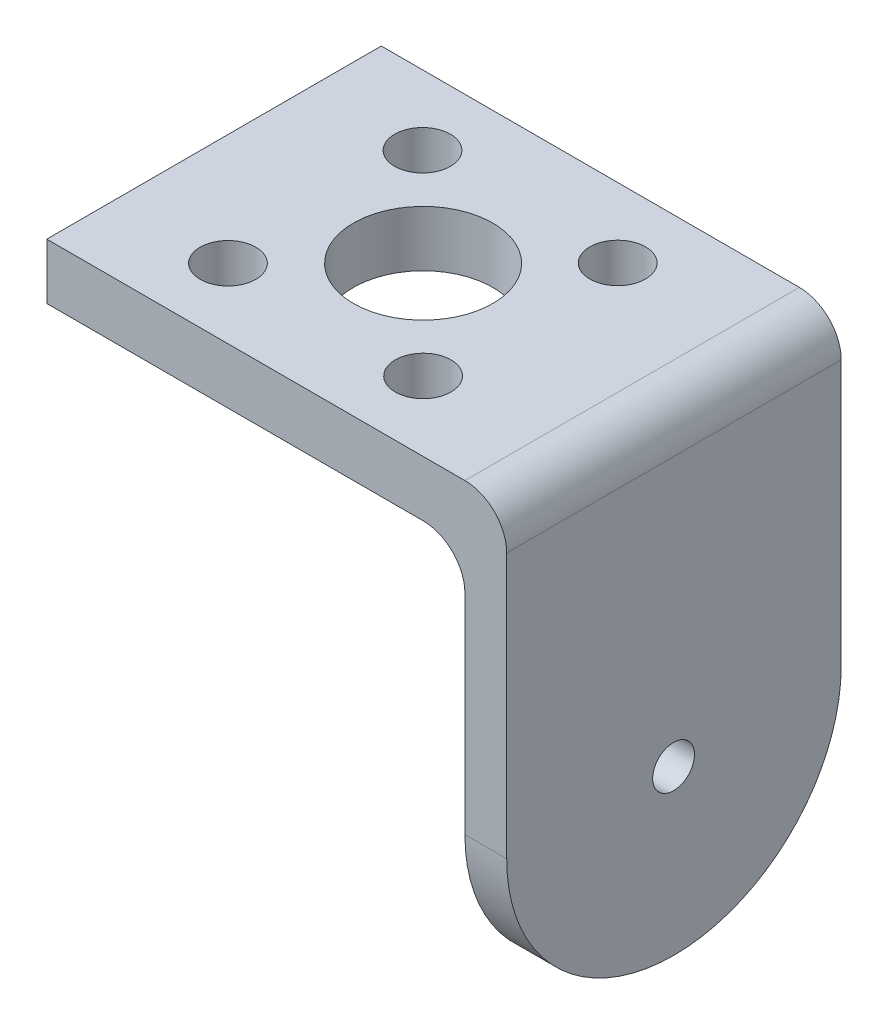
ISO-10303-21;
HEADER;
FILE_DESCRIPTION(('STEP AP214'),'2;1');
FILE_NAME('part.step','',(''),(''),'','','');
FILE_SCHEMA(('AUTOMOTIVE_DESIGN { 1 0 10303 214 1 1 1 1 }'));
ENDSEC;
DATA;
#1=APPLICATION_CONTEXT('core data for automotive mechanical design processes');
#2=APPLICATION_PROTOCOL_DEFINITION('international standard','automotive_design',2000,#1);
#3=PRODUCT_CONTEXT('',#1,'mechanical');
#4=PRODUCT('Part','Part','',(#3));
#5=PRODUCT_RELATED_PRODUCT_CATEGORY('part','',(#4));
#6=PRODUCT_DEFINITION_FORMATION('','',#4);
#7=PRODUCT_DEFINITION_CONTEXT('part definition',#1,'design');
#8=PRODUCT_DEFINITION('design','',#6,#7);
#9=PRODUCT_DEFINITION_SHAPE('','',#8);
#10=(LENGTH_UNIT() NAMED_UNIT(*) SI_UNIT(.MILLI.,.METRE.));
#11=(NAMED_UNIT(*) PLANE_ANGLE_UNIT() SI_UNIT($,.RADIAN.));
#12=(NAMED_UNIT(*) SI_UNIT($,.STERADIAN.) SOLID_ANGLE_UNIT());
#13=UNCERTAINTY_MEASURE_WITH_UNIT(LENGTH_MEASURE(1.E-05),#10,'distance_accuracy_value','');
#14=(GEOMETRIC_REPRESENTATION_CONTEXT(3) GLOBAL_UNCERTAINTY_ASSIGNED_CONTEXT((#13)) GLOBAL_UNIT_ASSIGNED_CONTEXT((#10,
#11,#12)) REPRESENTATION_CONTEXT('',''));
#15=CARTESIAN_POINT('',(0.,0.,0.));
#16=DIRECTION('',(0.,0.,1.));
#17=DIRECTION('',(1.,0.,0.));
#18=AXIS2_PLACEMENT_3D('',#15,#16,#17);
#19=CARTESIAN_POINT('',(30.,-7.00000000000002,24.));
#20=DIRECTION('',(1.,0.,0.));
#21=DIRECTION('',(0.,1.,0.));
#22=AXIS2_PLACEMENT_3D('',#19,#20,#21);
#23=PLANE('',#22);
#24=CARTESIAN_POINT('',(30.,-22.2557001159345,12.027919590865));
#25=DIRECTION('',(1.,0.,0.));
#26=DIRECTION('',(0.,1.,0.));
#27=AXIS2_PLACEMENT_3D('',#24,#25,#26);
#28=CIRCLE('',#27,1.5);
#29=CARTESIAN_POINT('',(30.,-20.7557001159345,12.027919590865));
#30=VERTEX_POINT('',#29);
#31=EDGE_CURVE('E287',#30,#30,#28,.T.);
#32=ORIENTED_EDGE('',*,*,#31,.T.);
#33=EDGE_LOOP('',(#32));
#34=FACE_BOUND('',#33,.T.);
#35=DIRECTION('',(0.,-1.,0.));
#36=VECTOR('',#35,1.);
#37=CARTESIAN_POINT('',(30.,-7.00000000000002,0.));
#38=LINE('',#37,#36);
#39=CARTESIAN_POINT('',(30.,-7.00000000000002,0.));
#40=VERTEX_POINT('',#39);
#41=CARTESIAN_POINT('',(30.,-22.,0.));
#42=VERTEX_POINT('',#41);
#43=EDGE_CURVE('E157',#40,#42,#38,.T.);
#44=ORIENTED_EDGE('',*,*,#43,.T.);
#45=CARTESIAN_POINT('',(30.,-22.,12.));
#46=DIRECTION('',(1.,0.,0.));
#47=DIRECTION('',(0.,1.,0.));
#48=AXIS2_PLACEMENT_3D('',#45,#46,#47);
#49=CIRCLE('',#48,12.);
#50=CARTESIAN_POINT('',(30.,-22.,24.));
#51=VERTEX_POINT('',#50);
#52=EDGE_CURVE('E141',#51,#42,#49,.T.);
#53=ORIENTED_EDGE('',*,*,#52,.F.);
#54=DIRECTION('',(0.,-1.,0.));
#55=VECTOR('',#54,1.);
#56=CARTESIAN_POINT('',(30.,-7.00000000000002,24.));
#57=LINE('',#56,#55);
#58=CARTESIAN_POINT('',(30.,-7.00000000000002,24.));
#59=VERTEX_POINT('',#58);
#60=EDGE_CURVE('E121',#59,#51,#57,.T.);
#61=ORIENTED_EDGE('',*,*,#60,.F.);
#62=DIRECTION('',(0.,0.,-1.));
#63=VECTOR('',#62,1.);
#64=CARTESIAN_POINT('',(30.,-7.00000000000002,24.));
#65=LINE('',#64,#63);
#66=EDGE_CURVE('E129',#59,#40,#65,.T.);
#67=ORIENTED_EDGE('',*,*,#66,.T.);
#68=EDGE_LOOP('',(#44,#53,#61,#67));
#69=FACE_BOUND('',#68,.T.);
#70=ADVANCED_FACE('F46',(#34,#69),#23,.F.);
#71=CARTESIAN_POINT('',(32.9974616048984,-3.00000000000002,24.));
#72=DIRECTION('',(-1.,0.,0.));
#73=DIRECTION('',(0.,0.,1.));
#74=AXIS2_PLACEMENT_3D('',#71,#72,#73);
#75=PLANE('',#74);
#76=CARTESIAN_POINT('',(32.9974616048984,-22.2557001159345,12.027919590865));
#77=DIRECTION('',(1.,0.,0.));
#78=DIRECTION('',(0.,0.,-1.));
#79=AXIS2_PLACEMENT_3D('',#76,#77,#78);
#80=CIRCLE('',#79,1.5);
#81=CARTESIAN_POINT('',(32.9974616048984,-22.2557001159345,10.527919590865));
#82=VERTEX_POINT('',#81);
#83=EDGE_CURVE('E289',#82,#82,#80,.T.);
#84=ORIENTED_EDGE('',*,*,#83,.F.);
#85=EDGE_LOOP('',(#84));
#86=FACE_BOUND('',#85,.T.);
#87=CARTESIAN_POINT('',(32.9974616048984,-22.,12.));
#88=DIRECTION('',(1.,0.,0.));
#89=DIRECTION('',(0.,0.,-1.));
#90=AXIS2_PLACEMENT_3D('',#87,#88,#89);
#91=CIRCLE('',#90,12.);
#92=CARTESIAN_POINT('',(32.9974616048984,-22.,24.));
#93=VERTEX_POINT('',#92);
#94=CARTESIAN_POINT('',(32.9974616048984,-22.,0.));
#95=VERTEX_POINT('',#94);
#96=EDGE_CURVE('E62',#93,#95,#91,.T.);
#97=ORIENTED_EDGE('',*,*,#96,.T.);
#98=DIRECTION('',(0.,1.,0.));
#99=VECTOR('',#98,1.);
#100=CARTESIAN_POINT('',(32.9974616048984,-3.00000000000002,0.));
#101=LINE('',#100,#99);
#102=CARTESIAN_POINT('',(32.9974616048984,-3.00000000000002,0.));
#103=VERTEX_POINT('',#102);
#104=EDGE_CURVE('E159',#95,#103,#101,.T.);
#105=ORIENTED_EDGE('',*,*,#104,.T.);
#106=DIRECTION('',(0.,0.,-1.));
#107=VECTOR('',#106,1.);
#108=CARTESIAN_POINT('',(32.9974616048984,-3.00000000000002,24.));
#109=LINE('',#108,#107);
#110=CARTESIAN_POINT('',(32.9974616048984,-3.00000000000002,24.));
#111=VERTEX_POINT('',#110);
#112=EDGE_CURVE('E137',#111,#103,#109,.T.);
#113=ORIENTED_EDGE('',*,*,#112,.F.);
#114=DIRECTION('',(0.,1.,0.));
#115=VECTOR('',#114,1.);
#116=CARTESIAN_POINT('',(32.9974616048984,-3.00000000000002,24.));
#117=LINE('',#116,#115);
#118=EDGE_CURVE('E142',#93,#111,#117,.T.);
#119=ORIENTED_EDGE('',*,*,#118,.F.);
#120=EDGE_LOOP('',(#97,#105,#113,#119));
#121=FACE_BOUND('',#120,.T.);
#122=ADVANCED_FACE('F209',(#86,#121),#75,.F.);
#123=CARTESIAN_POINT('',(29.9974616048984,-3.,0.));
#124=DIRECTION('',(0.,0.,1.));
#125=DIRECTION('',(1.,0.,0.));
#126=AXIS2_PLACEMENT_3D('',#123,#124,#125);
#127=PLANE('',#126);
#128=DIRECTION('',(1.,0.,0.));
#129=VECTOR('',#128,1.);
#130=CARTESIAN_POINT('',(-7.00253839510156,-22.,0.));
#131=LINE('',#130,#129);
#132=EDGE_CURVE('E12',#42,#95,#131,.T.);
#133=ORIENTED_EDGE('',*,*,#132,.F.);
#134=ORIENTED_EDGE('',*,*,#43,.F.);
#135=CARTESIAN_POINT('',(27.,-7.,0.));
#136=DIRECTION('',(0.,0.,-1.));
#137=DIRECTION('',(-1.,0.,0.));
#138=AXIS2_PLACEMENT_3D('',#135,#136,#137);
#139=CIRCLE('',#138,3.);
#140=CARTESIAN_POINT('',(27.,-4.,0.));
#141=VERTEX_POINT('',#140);
#142=EDGE_CURVE('E132',#141,#40,#139,.T.);
#143=ORIENTED_EDGE('',*,*,#142,.F.);
#144=DIRECTION('',(1.,0.,0.));
#145=VECTOR('',#144,1.);
#146=CARTESIAN_POINT('',(0.,-4.,0.));
#147=LINE('',#146,#145);
#148=CARTESIAN_POINT('',(0.,-4.,0.));
#149=VERTEX_POINT('',#148);
#150=EDGE_CURVE('E154',#149,#141,#147,.T.);
#151=ORIENTED_EDGE('',*,*,#150,.F.);
#152=DIRECTION('',(0.,-1.,0.));
#153=VECTOR('',#152,1.);
#154=CARTESIAN_POINT('',(0.,0.,0.));
#155=LINE('',#154,#153);
#156=CARTESIAN_POINT('',(0.,0.,0.));
#157=VERTEX_POINT('',#156);
#158=EDGE_CURVE('E152',#157,#149,#155,.T.);
#159=ORIENTED_EDGE('',*,*,#158,.F.);
#160=DIRECTION('',(-1.,0.,0.));
#161=VECTOR('',#160,1.);
#162=CARTESIAN_POINT('',(0.,0.,0.));
#163=LINE('',#162,#161);
#164=CARTESIAN_POINT('',(29.9974616048984,0.,0.));
#165=VERTEX_POINT('',#164);
#166=EDGE_CURVE('E149',#165,#157,#163,.T.);
#167=ORIENTED_EDGE('',*,*,#166,.F.);
#168=CARTESIAN_POINT('',(29.9974616048984,-3.,0.));
#169=DIRECTION('',(0.,0.,1.));
#170=DIRECTION('',(1.,0.,0.));
#171=AXIS2_PLACEMENT_3D('',#168,#169,#170);
#172=CIRCLE('',#171,3.);
#173=EDGE_CURVE('E98',#103,#165,#172,.T.);
#174=ORIENTED_EDGE('',*,*,#173,.F.);
#175=ORIENTED_EDGE('',*,*,#104,.F.);
#176=EDGE_LOOP('',(#133,#134,#143,#151,#159,#167,#174,#175));
#177=FACE_BOUND('',#176,.T.);
#178=ADVANCED_FACE('F215',(#177),#127,.F.);
#179=CARTESIAN_POINT('',(29.9974616048984,-3.,24.));
#180=DIRECTION('',(0.,0.,1.));
#181=DIRECTION('',(1.,0.,0.));
#182=AXIS2_PLACEMENT_3D('',#179,#180,#181);
#183=PLANE('',#182);
#184=ORIENTED_EDGE('',*,*,#60,.T.);
#185=DIRECTION('',(1.,0.,0.));
#186=VECTOR('',#185,1.);
#187=CARTESIAN_POINT('',(-7.00253839510156,-22.,24.));
#188=LINE('',#187,#186);
#189=EDGE_CURVE('E55',#51,#93,#188,.T.);
#190=ORIENTED_EDGE('',*,*,#189,.T.);
#191=ORIENTED_EDGE('',*,*,#118,.T.);
#192=CARTESIAN_POINT('',(29.9974616048984,-3.,24.));
#193=DIRECTION('',(0.,0.,1.));
#194=DIRECTION('',(1.,0.,0.));
#195=AXIS2_PLACEMENT_3D('',#192,#193,#194);
#196=CIRCLE('',#195,3.);
#197=CARTESIAN_POINT('',(29.9974616048984,0.,24.));
#198=VERTEX_POINT('',#197);
#199=EDGE_CURVE('E71',#111,#198,#196,.T.);
#200=ORIENTED_EDGE('',*,*,#199,.T.);
#201=DIRECTION('',(-1.,0.,0.));
#202=VECTOR('',#201,1.);
#203=CARTESIAN_POINT('',(0.,0.,24.));
#204=LINE('',#203,#202);
#205=CARTESIAN_POINT('',(0.,0.,24.));
#206=VERTEX_POINT('',#205);
#207=EDGE_CURVE('E162',#198,#206,#204,.T.);
#208=ORIENTED_EDGE('',*,*,#207,.T.);
#209=DIRECTION('',(0.,-1.,0.));
#210=VECTOR('',#209,1.);
#211=CARTESIAN_POINT('',(0.,0.,24.));
#212=LINE('',#211,#210);
#213=CARTESIAN_POINT('',(0.,-4.,24.));
#214=VERTEX_POINT('',#213);
#215=EDGE_CURVE('E107',#206,#214,#212,.T.);
#216=ORIENTED_EDGE('',*,*,#215,.T.);
#217=DIRECTION('',(1.,0.,0.));
#218=VECTOR('',#217,1.);
#219=CARTESIAN_POINT('',(0.,-4.,24.));
#220=LINE('',#219,#218);
#221=CARTESIAN_POINT('',(27.,-4.,24.));
#222=VERTEX_POINT('',#221);
#223=EDGE_CURVE('E123',#214,#222,#220,.T.);
#224=ORIENTED_EDGE('',*,*,#223,.T.);
#225=CARTESIAN_POINT('',(27.,-7.,24.));
#226=DIRECTION('',(0.,0.,-1.));
#227=DIRECTION('',(-1.,0.,0.));
#228=AXIS2_PLACEMENT_3D('',#225,#226,#227);
#229=CIRCLE('',#228,3.);
#230=EDGE_CURVE('E117',#222,#59,#229,.T.);
#231=ORIENTED_EDGE('',*,*,#230,.T.);
#232=EDGE_LOOP('',(#184,#190,#191,#200,#208,#216,#224,#231));
#233=FACE_BOUND('',#232,.T.);
#234=ADVANCED_FACE('F119',(#233),#183,.T.);
#235=CARTESIAN_POINT('',(0.,0.,24.));
#236=DIRECTION('',(0.,-1.,0.));
#237=DIRECTION('',(0.,0.,-1.));
#238=AXIS2_PLACEMENT_3D('',#235,#236,#237);
#239=PLANE('',#238);
#240=CARTESIAN_POINT('',(22.,0.,19.));
#241=DIRECTION('',(0.,1.,0.));
#242=DIRECTION('',(0.,0.,1.));
#243=AXIS2_PLACEMENT_3D('',#240,#241,#242);
#244=CIRCLE('',#243,2.);
#245=CARTESIAN_POINT('',(22.,0.,21.));
#246=VERTEX_POINT('',#245);
#247=EDGE_CURVE('E271',#246,#246,#244,.T.);
#248=ORIENTED_EDGE('',*,*,#247,.F.);
#249=EDGE_LOOP('',(#248));
#250=FACE_BOUND('',#249,.T.);
#251=CARTESIAN_POINT('',(21.9575797602447,0.,5.00006426717397));
#252=DIRECTION('',(0.,1.,0.));
#253=DIRECTION('',(0.,0.,1.));
#254=AXIS2_PLACEMENT_3D('',#251,#252,#253);
#255=CIRCLE('',#254,2.);
#256=CARTESIAN_POINT('',(21.9575797602447,0.,7.00006426717397));
#257=VERTEX_POINT('',#256);
#258=EDGE_CURVE('E273',#257,#257,#255,.T.);
#259=ORIENTED_EDGE('',*,*,#258,.F.);
#260=EDGE_LOOP('',(#259));
#261=FACE_BOUND('',#260,.T.);
#262=CARTESIAN_POINT('',(8.,0.,19.));
#263=DIRECTION('',(0.,1.,0.));
#264=DIRECTION('',(0.,0.,1.));
#265=AXIS2_PLACEMENT_3D('',#262,#263,#264);
#266=CIRCLE('',#265,2.);
#267=CARTESIAN_POINT('',(8.,0.,21.));
#268=VERTEX_POINT('',#267);
#269=EDGE_CURVE('E284',#268,#268,#266,.T.);
#270=ORIENTED_EDGE('',*,*,#269,.F.);
#271=EDGE_LOOP('',(#270));
#272=FACE_BOUND('',#271,.T.);
#273=CARTESIAN_POINT('',(15.,0.,12.));
#274=DIRECTION('',(0.,1.,0.));
#275=DIRECTION('',(0.,0.,1.));
#276=AXIS2_PLACEMENT_3D('',#273,#274,#275);
#277=CIRCLE('',#276,5.);
#278=CARTESIAN_POINT('',(15.,0.,17.));
#279=VERTEX_POINT('',#278);
#280=EDGE_CURVE('E280',#279,#279,#277,.T.);
#281=ORIENTED_EDGE('',*,*,#280,.F.);
#282=EDGE_LOOP('',(#281));
#283=FACE_BOUND('',#282,.T.);
#284=CARTESIAN_POINT('',(7.95757976024473,0.,5.00006426717397));
#285=DIRECTION('',(0.,1.,0.));
#286=DIRECTION('',(0.,0.,1.));
#287=AXIS2_PLACEMENT_3D('',#284,#285,#286);
#288=CIRCLE('',#287,2.);
#289=CARTESIAN_POINT('',(7.95757976024473,0.,7.00006426717397));
#290=VERTEX_POINT('',#289);
#291=EDGE_CURVE('E177',#290,#290,#288,.T.);
#292=ORIENTED_EDGE('',*,*,#291,.F.);
#293=EDGE_LOOP('',(#292));
#294=FACE_BOUND('',#293,.T.);
#295=ORIENTED_EDGE('',*,*,#166,.T.);
#296=DIRECTION('',(0.,0.,-1.));
#297=VECTOR('',#296,1.);
#298=CARTESIAN_POINT('',(0.,0.,24.));
#299=LINE('',#298,#297);
#300=EDGE_CURVE('E169',#206,#157,#299,.T.);
#301=ORIENTED_EDGE('',*,*,#300,.F.);
#302=ORIENTED_EDGE('',*,*,#207,.F.);
#303=DIRECTION('',(0.,0.,-1.));
#304=VECTOR('',#303,1.);
#305=CARTESIAN_POINT('',(29.9974616048984,0.,24.));
#306=LINE('',#305,#304);
#307=EDGE_CURVE('E148',#198,#165,#306,.T.);
#308=ORIENTED_EDGE('',*,*,#307,.T.);
#309=EDGE_LOOP('',(#295,#301,#302,#308));
#310=FACE_BOUND('',#309,.T.);
#311=ADVANCED_FACE('F48',(#250,#261,#272,#283,#294,#310),#239,.F.);
#312=CARTESIAN_POINT('',(0.,0.,24.));
#313=DIRECTION('',(1.,0.,0.));
#314=DIRECTION('',(0.,0.,-1.));
#315=AXIS2_PLACEMENT_3D('',#312,#313,#314);
#316=PLANE('',#315);
#317=ORIENTED_EDGE('',*,*,#158,.T.);
#318=DIRECTION('',(0.,0.,-1.));
#319=VECTOR('',#318,1.);
#320=CARTESIAN_POINT('',(0.,-4.,24.));
#321=LINE('',#320,#319);
#322=EDGE_CURVE('E166',#214,#149,#321,.T.);
#323=ORIENTED_EDGE('',*,*,#322,.F.);
#324=ORIENTED_EDGE('',*,*,#215,.F.);
#325=ORIENTED_EDGE('',*,*,#300,.T.);
#326=EDGE_LOOP('',(#317,#323,#324,#325));
#327=FACE_BOUND('',#326,.T.);
#328=ADVANCED_FACE('F225',(#327),#316,.F.);
#329=CARTESIAN_POINT('',(0.,-4.,24.));
#330=DIRECTION('',(0.,1.,0.));
#331=DIRECTION('',(0.,0.,1.));
#332=AXIS2_PLACEMENT_3D('',#329,#330,#331);
#333=PLANE('',#332);
#334=CARTESIAN_POINT('',(22.,-4.,19.));
#335=DIRECTION('',(0.,1.,0.));
#336=DIRECTION('',(0.,0.,1.));
#337=AXIS2_PLACEMENT_3D('',#334,#335,#336);
#338=CIRCLE('',#337,2.);
#339=CARTESIAN_POINT('',(22.,-4.,21.));
#340=VERTEX_POINT('',#339);
#341=EDGE_CURVE('E50',#340,#340,#338,.T.);
#342=ORIENTED_EDGE('',*,*,#341,.T.);
#343=EDGE_LOOP('',(#342));
#344=FACE_BOUND('',#343,.T.);
#345=CARTESIAN_POINT('',(21.9575797602447,-4.,5.00006426717397));
#346=DIRECTION('',(0.,1.,0.));
#347=DIRECTION('',(0.,0.,1.));
#348=AXIS2_PLACEMENT_3D('',#345,#346,#347);
#349=CIRCLE('',#348,2.);
#350=CARTESIAN_POINT('',(21.9575797602447,-4.,7.00006426717397));
#351=VERTEX_POINT('',#350);
#352=EDGE_CURVE('E182',#351,#351,#349,.T.);
#353=ORIENTED_EDGE('',*,*,#352,.T.);
#354=EDGE_LOOP('',(#353));
#355=FACE_BOUND('',#354,.T.);
#356=CARTESIAN_POINT('',(8.,-4.,19.));
#357=DIRECTION('',(0.,1.,0.));
#358=DIRECTION('',(0.,0.,1.));
#359=AXIS2_PLACEMENT_3D('',#356,#357,#358);
#360=CIRCLE('',#359,2.);
#361=CARTESIAN_POINT('',(8.,-4.,21.));
#362=VERTEX_POINT('',#361);
#363=EDGE_CURVE('E180',#362,#362,#360,.T.);
#364=ORIENTED_EDGE('',*,*,#363,.T.);
#365=EDGE_LOOP('',(#364));
#366=FACE_BOUND('',#365,.T.);
#367=CARTESIAN_POINT('',(15.,-4.,12.));
#368=DIRECTION('',(0.,1.,0.));
#369=DIRECTION('',(0.,0.,1.));
#370=AXIS2_PLACEMENT_3D('',#367,#368,#369);
#371=CIRCLE('',#370,5.);
#372=CARTESIAN_POINT('',(15.,-4.,17.));
#373=VERTEX_POINT('',#372);
#374=EDGE_CURVE('E176',#373,#373,#371,.T.);
#375=ORIENTED_EDGE('',*,*,#374,.T.);
#376=EDGE_LOOP('',(#375));
#377=FACE_BOUND('',#376,.T.);
#378=CARTESIAN_POINT('',(7.95757976024473,-4.,5.00006426717397));
#379=DIRECTION('',(0.,1.,0.));
#380=DIRECTION('',(0.,0.,1.));
#381=AXIS2_PLACEMENT_3D('',#378,#379,#380);
#382=CIRCLE('',#381,2.);
#383=CARTESIAN_POINT('',(7.95757976024473,-4.,7.00006426717397));
#384=VERTEX_POINT('',#383);
#385=EDGE_CURVE('E173',#384,#384,#382,.T.);
#386=ORIENTED_EDGE('',*,*,#385,.T.);
#387=EDGE_LOOP('',(#386));
#388=FACE_BOUND('',#387,.T.);
#389=ORIENTED_EDGE('',*,*,#150,.T.);
#390=DIRECTION('',(0.,0.,-1.));
#391=VECTOR('',#390,1.);
#392=CARTESIAN_POINT('',(27.,-4.,24.));
#393=LINE('',#392,#391);
#394=EDGE_CURVE('E136',#222,#141,#393,.T.);
#395=ORIENTED_EDGE('',*,*,#394,.F.);
#396=ORIENTED_EDGE('',*,*,#223,.F.);
#397=ORIENTED_EDGE('',*,*,#322,.T.);
#398=EDGE_LOOP('',(#389,#395,#396,#397));
#399=FACE_BOUND('',#398,.T.);
#400=ADVANCED_FACE('F189',(#344,#355,#366,#377,#388,#399),#333,.F.);
#401=CARTESIAN_POINT('',(27.,-7.,24.));
#402=DIRECTION('',(0.,0.,-1.));
#403=DIRECTION('',(-1.,0.,0.));
#404=AXIS2_PLACEMENT_3D('',#401,#402,#403);
#405=CYLINDRICAL_SURFACE('',#404,3.);
#406=ORIENTED_EDGE('',*,*,#142,.T.);
#407=ORIENTED_EDGE('',*,*,#66,.F.);
#408=ORIENTED_EDGE('',*,*,#230,.F.);
#409=ORIENTED_EDGE('',*,*,#394,.T.);
#410=EDGE_LOOP('',(#406,#407,#408,#409));
#411=FACE_BOUND('',#410,.T.);
#412=ADVANCED_FACE('F130',(#411),#405,.F.);
#413=CARTESIAN_POINT('',(29.9974616048984,-3.,24.));
#414=DIRECTION('',(0.,0.,-1.));
#415=DIRECTION('',(-1.,0.,0.));
#416=AXIS2_PLACEMENT_3D('',#413,#414,#415);
#417=CYLINDRICAL_SURFACE('',#416,3.);
#418=ORIENTED_EDGE('',*,*,#173,.T.);
#419=ORIENTED_EDGE('',*,*,#307,.F.);
#420=ORIENTED_EDGE('',*,*,#199,.F.);
#421=ORIENTED_EDGE('',*,*,#112,.T.);
#422=EDGE_LOOP('',(#418,#419,#420,#421));
#423=FACE_BOUND('',#422,.T.);
#424=ADVANCED_FACE('F223',(#423),#417,.T.);
#425=CARTESIAN_POINT('',(-7.00253839510156,-22.,12.));
#426=DIRECTION('',(1.,0.,0.));
#427=DIRECTION('',(0.,0.,-1.));
#428=AXIS2_PLACEMENT_3D('',#425,#426,#427);
#429=CYLINDRICAL_SURFACE('',#428,12.);
#430=ORIENTED_EDGE('',*,*,#52,.T.);
#431=ORIENTED_EDGE('',*,*,#132,.T.);
#432=ORIENTED_EDGE('',*,*,#96,.F.);
#433=ORIENTED_EDGE('',*,*,#189,.F.);
#434=EDGE_LOOP('',(#430,#431,#432,#433));
#435=FACE_BOUND('',#434,.T.);
#436=ADVANCED_FACE('F244',(#435),#429,.T.);
#437=CARTESIAN_POINT('',(7.95757976024473,-40.,5.00006426717397));
#438=DIRECTION('',(0.,1.,0.));
#439=DIRECTION('',(0.,0.,1.));
#440=AXIS2_PLACEMENT_3D('',#437,#438,#439);
#441=CYLINDRICAL_SURFACE('',#440,2.);
#442=ORIENTED_EDGE('',*,*,#291,.T.);
#443=EDGE_LOOP('',(#442));
#444=FACE_BOUND('',#443,.T.);
#445=ORIENTED_EDGE('',*,*,#385,.F.);
#446=EDGE_LOOP('',(#445));
#447=FACE_BOUND('',#446,.T.);
#448=ADVANCED_FACE('F251',(#444,#447),#441,.F.);
#449=CARTESIAN_POINT('',(15.,-40.,12.));
#450=DIRECTION('',(0.,1.,0.));
#451=DIRECTION('',(0.,0.,1.));
#452=AXIS2_PLACEMENT_3D('',#449,#450,#451);
#453=CYLINDRICAL_SURFACE('',#452,5.);
#454=ORIENTED_EDGE('',*,*,#280,.T.);
#455=EDGE_LOOP('',(#454));
#456=FACE_BOUND('',#455,.T.);
#457=ORIENTED_EDGE('',*,*,#374,.F.);
#458=EDGE_LOOP('',(#457));
#459=FACE_BOUND('',#458,.T.);
#460=ADVANCED_FACE('F259',(#456,#459),#453,.F.);
#461=CARTESIAN_POINT('',(8.,-40.,19.));
#462=DIRECTION('',(0.,1.,0.));
#463=DIRECTION('',(0.,0.,1.));
#464=AXIS2_PLACEMENT_3D('',#461,#462,#463);
#465=CYLINDRICAL_SURFACE('',#464,2.);
#466=ORIENTED_EDGE('',*,*,#269,.T.);
#467=EDGE_LOOP('',(#466));
#468=FACE_BOUND('',#467,.T.);
#469=ORIENTED_EDGE('',*,*,#363,.F.);
#470=EDGE_LOOP('',(#469));
#471=FACE_BOUND('',#470,.T.);
#472=ADVANCED_FACE('F203',(#468,#471),#465,.F.);
#473=CARTESIAN_POINT('',(21.9575797602447,-40.,5.00006426717397));
#474=DIRECTION('',(0.,1.,0.));
#475=DIRECTION('',(0.,0.,1.));
#476=AXIS2_PLACEMENT_3D('',#473,#474,#475);
#477=CYLINDRICAL_SURFACE('',#476,2.);
#478=ORIENTED_EDGE('',*,*,#258,.T.);
#479=EDGE_LOOP('',(#478));
#480=FACE_BOUND('',#479,.T.);
#481=ORIENTED_EDGE('',*,*,#352,.F.);
#482=EDGE_LOOP('',(#481));
#483=FACE_BOUND('',#482,.T.);
#484=ADVANCED_FACE('F194',(#480,#483),#477,.F.);
#485=CARTESIAN_POINT('',(22.,-40.,19.));
#486=DIRECTION('',(0.,1.,0.));
#487=DIRECTION('',(0.,0.,1.));
#488=AXIS2_PLACEMENT_3D('',#485,#486,#487);
#489=CYLINDRICAL_SURFACE('',#488,2.);
#490=ORIENTED_EDGE('',*,*,#247,.T.);
#491=EDGE_LOOP('',(#490));
#492=FACE_BOUND('',#491,.T.);
#493=ORIENTED_EDGE('',*,*,#341,.F.);
#494=EDGE_LOOP('',(#493));
#495=FACE_BOUND('',#494,.T.);
#496=ADVANCED_FACE('F191',(#492,#495),#489,.F.);
#497=CARTESIAN_POINT('',(22.9974616048984,-22.2557001159345,12.027919590865));
#498=DIRECTION('',(1.,0.,0.));
#499=DIRECTION('',(0.,0.,-1.));
#500=AXIS2_PLACEMENT_3D('',#497,#498,#499);
#501=CYLINDRICAL_SURFACE('',#500,1.5);
#502=ORIENTED_EDGE('',*,*,#83,.T.);
#503=EDGE_LOOP('',(#502));
#504=FACE_BOUND('',#503,.T.);
#505=ORIENTED_EDGE('',*,*,#31,.F.);
#506=EDGE_LOOP('',(#505));
#507=FACE_BOUND('',#506,.T.);
#508=ADVANCED_FACE('F193',(#504,#507),#501,.F.);
#509=CLOSED_SHELL('',(#70,#122,#178,#234,#311,#328,#400,#412,#424,#436,#448,#460,#472,#484,#496,#508));
#510=MANIFOLD_SOLID_BREP('B2',#509);
#511=ADVANCED_BREP_SHAPE_REPRESENTATION('',(#18,#510),#14);
#512=SHAPE_DEFINITION_REPRESENTATION(#9,#511);
ENDSEC;
END-ISO-10303-21;
